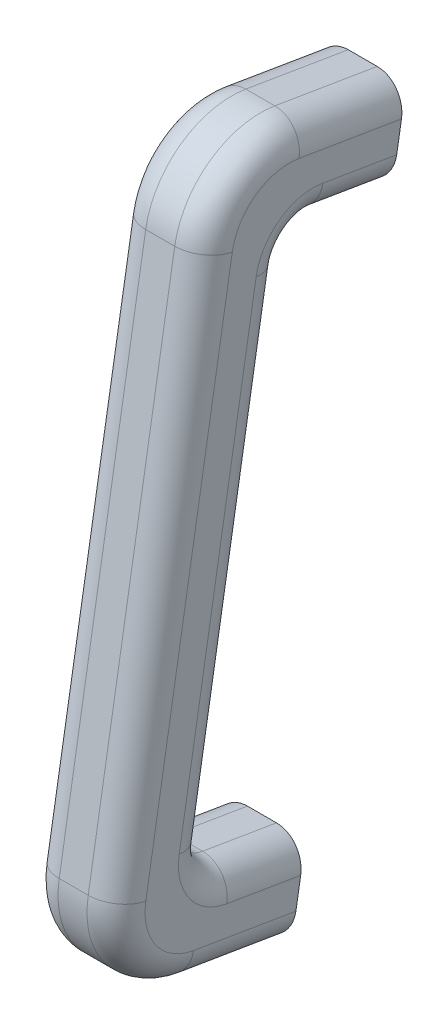
ISO-10303-21;
HEADER;
FILE_DESCRIPTION(('STEP AP214'),'2;1');
FILE_NAME('part.step','',(''),(''),'','','');
FILE_SCHEMA(('AUTOMOTIVE_DESIGN { 1 0 10303 214 1 1 1 1 }'));
ENDSEC;
DATA;
#1=APPLICATION_CONTEXT('core data for automotive mechanical design processes');
#2=APPLICATION_PROTOCOL_DEFINITION('international standard','automotive_design',2000,#1);
#3=PRODUCT_CONTEXT('',#1,'mechanical');
#4=PRODUCT('Part','Part','',(#3));
#5=PRODUCT_RELATED_PRODUCT_CATEGORY('part','',(#4));
#6=PRODUCT_DEFINITION_FORMATION('','',#4);
#7=PRODUCT_DEFINITION_CONTEXT('part definition',#1,'design');
#8=PRODUCT_DEFINITION('design','',#6,#7);
#9=PRODUCT_DEFINITION_SHAPE('','',#8);
#10=(LENGTH_UNIT() NAMED_UNIT(*) SI_UNIT(.MILLI.,.METRE.));
#11=(NAMED_UNIT(*) PLANE_ANGLE_UNIT() SI_UNIT($,.RADIAN.));
#12=(NAMED_UNIT(*) SI_UNIT($,.STERADIAN.) SOLID_ANGLE_UNIT());
#13=UNCERTAINTY_MEASURE_WITH_UNIT(LENGTH_MEASURE(1.E-05),#10,'distance_accuracy_value','');
#14=(GEOMETRIC_REPRESENTATION_CONTEXT(3) GLOBAL_UNCERTAINTY_ASSIGNED_CONTEXT((#13)) GLOBAL_UNIT_ASSIGNED_CONTEXT((#10,
#11,#12)) REPRESENTATION_CONTEXT('',''));
#15=CARTESIAN_POINT('',(0.,0.,0.));
#16=DIRECTION('',(0.,0.,1.));
#17=DIRECTION('',(1.,0.,0.));
#18=AXIS2_PLACEMENT_3D('',#15,#16,#17);
#19=CARTESIAN_POINT('',(1797.5,1188.32020540186,1266.62931115991));
#20=DIRECTION('',(0.,-0.986393923832143,0.164398987305364));
#21=DIRECTION('',(0.,-0.164398987305364,-0.986393923832143));
#22=AXIS2_PLACEMENT_3D('',#19,#20,#21);
#23=PLANE('',#22);
#24=DIRECTION('',(1.,0.,0.));
#25=VECTOR('',#24,1.);
#26=CARTESIAN_POINT('',(1797.5,1185.85422059228,1251.83340230243));
#27=LINE('',#26,#25);
#28=CARTESIAN_POINT('',(1802.5,1185.85422059228,1251.83340230243));
#29=VERTEX_POINT('',#28);
#30=CARTESIAN_POINT('',(1807.5,1185.85422059228,1251.83340230243));
#31=VERTEX_POINT('',#30);
#32=EDGE_CURVE('E220',#29,#31,#27,.T.);
#33=ORIENTED_EDGE('',*,*,#32,.T.);
#34=DIRECTION('',(0.,-0.164398987305364,-0.986393923832143));
#35=VECTOR('',#34,1.);
#36=CARTESIAN_POINT('',(1807.5,1188.32020540186,1266.62931115991));
#37=LINE('',#36,#35);
#38=CARTESIAN_POINT('',(1807.5,1182.91220344615,1234.18129942564));
#39=VERTEX_POINT('',#38);
#40=EDGE_CURVE('E309',#31,#39,#37,.T.);
#41=ORIENTED_EDGE('',*,*,#40,.T.);
#42=DIRECTION('',(1.,0.,0.));
#43=VECTOR('',#42,1.);
#44=CARTESIAN_POINT('',(1797.5,1182.91220344615,1234.18129942564));
#45=LINE('',#44,#43);
#46=CARTESIAN_POINT('',(1802.5,1182.91220344615,1234.18129942564));
#47=VERTEX_POINT('',#46);
#48=EDGE_CURVE('E482',#47,#39,#45,.T.);
#49=ORIENTED_EDGE('',*,*,#48,.F.);
#50=DIRECTION('',(0.,-0.164398987305364,-0.986393923832143));
#51=VECTOR('',#50,1.);
#52=CARTESIAN_POINT('',(1802.5,1185.85422059228,1251.83340230243));
#53=LINE('',#52,#51);
#54=EDGE_CURVE('E306',#47,#29,#53,.F.);
#55=ORIENTED_EDGE('',*,*,#54,.T.);
#56=EDGE_LOOP('',(#33,#41,#49,#55));
#57=FACE_BOUND('',#56,.T.);
#58=ADVANCED_FACE('F17',(#57),#23,.F.);
#59=CARTESIAN_POINT('',(1797.5,1182.91220344615,1234.18129942564));
#60=DIRECTION('',(0.,0.164398987305352,0.986393923832145));
#61=DIRECTION('',(0.,-0.986393923832145,0.164398987305352));
#62=AXIS2_PLACEMENT_3D('',#59,#60,#61);
#63=PLANE('',#62);
#64=ORIENTED_EDGE('',*,*,#48,.T.);
#65=CARTESIAN_POINT('',(1807.5,1177.98023382699,1235.00329436217));
#66=DIRECTION('',(0.,0.164398987305352,0.986393923832145));
#67=DIRECTION('',(0.,-0.986393923832145,0.164398987305352));
#68=AXIS2_PLACEMENT_3D('',#65,#66,#67);
#69=CIRCLE('',#68,5.);
#70=CARTESIAN_POINT('',(1812.5,1177.98023382699,1235.00329436217));
#71=VERTEX_POINT('',#70);
#72=EDGE_CURVE('E321',#39,#71,#69,.F.);
#73=ORIENTED_EDGE('',*,*,#72,.T.);
#74=DIRECTION('',(0.,-0.986393923832145,0.164398987305352));
#75=VECTOR('',#74,1.);
#76=CARTESIAN_POINT('',(1812.5,1182.91220344615,1234.18129942564));
#77=LINE('',#76,#75);
#78=CARTESIAN_POINT('',(1812.5,1173.04826420783,1235.82528929869));
#79=VERTEX_POINT('',#78);
#80=EDGE_CURVE('E391',#71,#79,#77,.T.);
#81=ORIENTED_EDGE('',*,*,#80,.T.);
#82=CARTESIAN_POINT('',(1807.5,1173.04826420783,1235.82528929869));
#83=DIRECTION('',(0.,0.164398987305352,0.986393923832145));
#84=DIRECTION('',(0.,-0.986393923832145,0.164398987305352));
#85=AXIS2_PLACEMENT_3D('',#82,#83,#84);
#86=CIRCLE('',#85,5.);
#87=CARTESIAN_POINT('',(1807.5,1168.11629458867,1236.64728423522));
#88=VERTEX_POINT('',#87);
#89=EDGE_CURVE('E318',#79,#88,#86,.F.);
#90=ORIENTED_EDGE('',*,*,#89,.T.);
#91=DIRECTION('',(1.,0.,0.));
#92=VECTOR('',#91,1.);
#93=CARTESIAN_POINT('',(1797.5,1168.11629458867,1236.64728423522));
#94=LINE('',#93,#92);
#95=CARTESIAN_POINT('',(1802.5,1168.11629458867,1236.64728423522));
#96=VERTEX_POINT('',#95);
#97=EDGE_CURVE('E478',#96,#88,#94,.T.);
#98=ORIENTED_EDGE('',*,*,#97,.F.);
#99=CARTESIAN_POINT('',(1802.5,1173.04826420783,1235.82528929869));
#100=DIRECTION('',(0.,0.164398987305352,0.986393923832145));
#101=DIRECTION('',(0.,-0.986393923832145,0.164398987305352));
#102=AXIS2_PLACEMENT_3D('',#99,#100,#101);
#103=CIRCLE('',#102,5.);
#104=CARTESIAN_POINT('',(1797.5,1173.04826420783,1235.82528929869));
#105=VERTEX_POINT('',#104);
#106=EDGE_CURVE('E312',#96,#105,#103,.F.);
#107=ORIENTED_EDGE('',*,*,#106,.T.);
#108=DIRECTION('',(0.,-0.986393923832145,0.164398987305352));
#109=VECTOR('',#108,1.);
#110=CARTESIAN_POINT('',(1797.5,1182.91220344615,1234.18129942564));
#111=LINE('',#110,#109);
#112=CARTESIAN_POINT('',(1797.5,1177.98023382699,1235.00329436217));
#113=VERTEX_POINT('',#112);
#114=EDGE_CURVE('E461',#113,#105,#111,.T.);
#115=ORIENTED_EDGE('',*,*,#114,.F.);
#116=CARTESIAN_POINT('',(1802.5,1177.98023382699,1235.00329436217));
#117=DIRECTION('',(0.,0.164398987305352,0.986393923832145));
#118=DIRECTION('',(0.,-0.986393923832145,0.164398987305352));
#119=AXIS2_PLACEMENT_3D('',#116,#117,#118);
#120=CIRCLE('',#119,5.);
#121=EDGE_CURVE('E315',#113,#47,#120,.F.);
#122=ORIENTED_EDGE('',*,*,#121,.T.);
#123=EDGE_LOOP('',(#64,#73,#81,#90,#98,#107,#115,#122));
#124=FACE_BOUND('',#123,.T.);
#125=ADVANCED_FACE('F507',(#124),#63,.F.);
#126=CARTESIAN_POINT('',(1797.5,1168.11629458867,1236.64728423522));
#127=DIRECTION('',(0.,0.986393923832145,-0.164398987305349));
#128=DIRECTION('',(0.,0.164398987305349,0.986393923832145));
#129=AXIS2_PLACEMENT_3D('',#126,#127,#128);
#130=PLANE('',#129);
#131=ORIENTED_EDGE('',*,*,#97,.T.);
#132=DIRECTION('',(0.,0.164398987305349,0.986393923832145));
#133=VECTOR('',#132,1.);
#134=CARTESIAN_POINT('',(1807.5,1168.11629458867,1236.64728423522));
#135=LINE('',#134,#133);
#136=CARTESIAN_POINT('',(1807.5,1170.23631679827,1249.36741749285));
#137=VERTEX_POINT('',#136);
#138=EDGE_CURVE('E352',#88,#137,#135,.T.);
#139=ORIENTED_EDGE('',*,*,#138,.T.);
#140=DIRECTION('',(1.,0.,0.));
#141=VECTOR('',#140,1.);
#142=CARTESIAN_POINT('',(1797.5,1170.23631679827,1249.36741749285));
#143=LINE('',#142,#141);
#144=CARTESIAN_POINT('',(1802.5,1170.23631679827,1249.36741749285));
#145=VERTEX_POINT('',#144);
#146=EDGE_CURVE('E243',#137,#145,#143,.F.);
#147=ORIENTED_EDGE('',*,*,#146,.T.);
#148=DIRECTION('',(0.,0.164398987305349,0.986393923832145));
#149=VECTOR('',#148,1.);
#150=CARTESIAN_POINT('',(1802.5,1168.11629458867,1236.64728423522));
#151=LINE('',#150,#149);
#152=EDGE_CURVE('E349',#145,#96,#151,.F.);
#153=ORIENTED_EDGE('',*,*,#152,.T.);
#154=EDGE_LOOP('',(#131,#139,#147,#153));
#155=FACE_BOUND('',#154,.T.);
#156=ADVANCED_FACE('F527',(#155),#130,.F.);
#157=CARTESIAN_POINT('',(1797.5,1171.0583117348,1254.29938711201));
#158=DIRECTION('',(0.,0.16439898730535,0.986393923832145));
#159=DIRECTION('',(0.,-0.986393923832145,0.16439898730535));
#160=AXIS2_PLACEMENT_3D('',#157,#158,#159);
#161=PLANE('',#160);
#162=DIRECTION('',(1.,0.,0.));
#163=VECTOR('',#162,1.);
#164=CARTESIAN_POINT('',(1812.5,1166.12634211564,1255.12138204854));
#165=LINE('',#164,#163);
#166=CARTESIAN_POINT('',(1802.5,1166.12634211564,1255.12138204854));
#167=VERTEX_POINT('',#166);
#168=CARTESIAN_POINT('',(1807.5,1166.12634211564,1255.12138204854));
#169=VERTEX_POINT('',#168);
#170=EDGE_CURVE('E239',#167,#169,#165,.T.);
#171=ORIENTED_EDGE('',*,*,#170,.T.);
#172=DIRECTION('',(0.,-0.986393923832145,0.16439898730535));
#173=VECTOR('',#172,1.);
#174=CARTESIAN_POINT('',(1807.5,1171.0583117348,1254.29938711201));
#175=LINE('',#174,#173);
#176=CARTESIAN_POINT('',(1807.5,1086.55049818209,1268.38402270413));
#177=VERTEX_POINT('',#176);
#178=EDGE_CURVE('E340',#169,#177,#175,.T.);
#179=ORIENTED_EDGE('',*,*,#178,.T.);
#180=DIRECTION('',(1.,0.,0.));
#181=VECTOR('',#180,1.);
#182=CARTESIAN_POINT('',(1797.5,1086.55049818209,1268.38402270413));
#183=LINE('',#182,#181);
#184=CARTESIAN_POINT('',(1802.5,1086.55049818209,1268.38402270413));
#185=VERTEX_POINT('',#184);
#186=EDGE_CURVE('E229',#177,#185,#183,.F.);
#187=ORIENTED_EDGE('',*,*,#186,.T.);
#188=DIRECTION('',(0.,-0.986393923832145,0.16439898730535));
#189=VECTOR('',#188,1.);
#190=CARTESIAN_POINT('',(1802.5,1166.12634211564,1255.12138204854));
#191=LINE('',#190,#189);
#192=EDGE_CURVE('E337',#185,#167,#191,.F.);
#193=ORIENTED_EDGE('',*,*,#192,.T.);
#194=EDGE_LOOP('',(#171,#179,#187,#193));
#195=FACE_BOUND('',#194,.T.);
#196=ADVANCED_FACE('F540',(#195),#161,.F.);
#197=CARTESIAN_POINT('',(1797.5,1081.61852856293,1269.20601764065));
#198=DIRECTION('',(0.,-0.986393923832144,0.164398987305353));
#199=DIRECTION('',(0.,-0.164398987305353,-0.986393923832145));
#200=AXIS2_PLACEMENT_3D('',#197,#198,#199);
#201=PLANE('',#200);
#202=DIRECTION('',(1.,0.,0.));
#203=VECTOR('',#202,1.);
#204=CARTESIAN_POINT('',(1812.5,1080.7965336264,1264.27404802149));
#205=LINE('',#204,#203);
#206=CARTESIAN_POINT('',(1802.5,1080.7965336264,1264.27404802149));
#207=VERTEX_POINT('',#206);
#208=CARTESIAN_POINT('',(1807.5,1080.7965336264,1264.27404802149));
#209=VERTEX_POINT('',#208);
#210=EDGE_CURVE('E247',#207,#209,#205,.T.);
#211=ORIENTED_EDGE('',*,*,#210,.T.);
#212=DIRECTION('',(0.,-0.164398987305353,-0.986393923832145));
#213=VECTOR('',#212,1.);
#214=CARTESIAN_POINT('',(1807.5,1081.61852856293,1269.20601764065));
#215=LINE('',#214,#213);
#216=CARTESIAN_POINT('',(1807.5,1078.6765114168,1251.55391476386));
#217=VERTEX_POINT('',#216);
#218=EDGE_CURVE('E327',#209,#217,#215,.T.);
#219=ORIENTED_EDGE('',*,*,#218,.T.);
#220=DIRECTION('',(1.,0.,0.));
#221=VECTOR('',#220,1.);
#222=CARTESIAN_POINT('',(1797.5,1078.6765114168,1251.55391476386));
#223=LINE('',#222,#221);
#224=CARTESIAN_POINT('',(1802.5,1078.6765114168,1251.55391476386));
#225=VERTEX_POINT('',#224);
#226=EDGE_CURVE('E465',#225,#217,#223,.T.);
#227=ORIENTED_EDGE('',*,*,#226,.F.);
#228=DIRECTION('',(0.,-0.164398987305353,-0.986393923832145));
#229=VECTOR('',#228,1.);
#230=CARTESIAN_POINT('',(1802.5,1080.7965336264,1264.27404802149));
#231=LINE('',#230,#229);
#232=EDGE_CURVE('E324',#225,#207,#231,.F.);
#233=ORIENTED_EDGE('',*,*,#232,.T.);
#234=EDGE_LOOP('',(#211,#219,#227,#233));
#235=FACE_BOUND('',#234,.T.);
#236=ADVANCED_FACE('F559',(#235),#201,.F.);
#237=CARTESIAN_POINT('',(1797.5,1078.6765114168,1251.55391476386));
#238=DIRECTION('',(0.,0.16439898730535,0.986393923832145));
#239=DIRECTION('',(0.,-0.986393923832145,0.16439898730535));
#240=AXIS2_PLACEMENT_3D('',#237,#238,#239);
#241=PLANE('',#240);
#242=DIRECTION('',(0.,-0.986393923832145,0.16439898730535));
#243=VECTOR('',#242,1.);
#244=CARTESIAN_POINT('',(1812.5,1078.6765114168,1251.55391476386));
#245=LINE('',#244,#243);
#246=CARTESIAN_POINT('',(1812.5,1073.74454179764,1252.37590970039));
#247=VERTEX_POINT('',#246);
#248=CARTESIAN_POINT('',(1812.5,1068.81257217848,1253.19790463692));
#249=VERTEX_POINT('',#248);
#250=EDGE_CURVE('E469',#247,#249,#245,.T.);
#251=ORIENTED_EDGE('',*,*,#250,.T.);
#252=CARTESIAN_POINT('',(1807.5,1068.81257217848,1253.19790463692));
#253=DIRECTION('',(0.,0.16439898730535,0.986393923832145));
#254=DIRECTION('',(0.,-0.986393923832145,0.16439898730535));
#255=AXIS2_PLACEMENT_3D('',#252,#253,#254);
#256=CIRCLE('',#255,5.);
#257=CARTESIAN_POINT('',(1807.5,1063.88060255931,1254.01989957345));
#258=VERTEX_POINT('',#257);
#259=EDGE_CURVE('E290',#249,#258,#256,.F.);
#260=ORIENTED_EDGE('',*,*,#259,.T.);
#261=DIRECTION('',(1.,0.,0.));
#262=VECTOR('',#261,1.);
#263=CARTESIAN_POINT('',(1797.5,1063.88060255931,1254.01989957345));
#264=LINE('',#263,#262);
#265=CARTESIAN_POINT('',(1802.5,1063.88060255931,1254.01989957345));
#266=VERTEX_POINT('',#265);
#267=EDGE_CURVE('E212',#266,#258,#264,.T.);
#268=ORIENTED_EDGE('',*,*,#267,.F.);
#269=CARTESIAN_POINT('',(1802.5,1068.81257217848,1253.19790463692));
#270=DIRECTION('',(0.,0.16439898730535,0.986393923832145));
#271=DIRECTION('',(0.,-0.986393923832145,0.16439898730535));
#272=AXIS2_PLACEMENT_3D('',#269,#270,#271);
#273=CIRCLE('',#272,5.);
#274=CARTESIAN_POINT('',(1797.5,1068.81257217848,1253.19790463692));
#275=VERTEX_POINT('',#274);
#276=EDGE_CURVE('E284',#266,#275,#273,.F.);
#277=ORIENTED_EDGE('',*,*,#276,.T.);
#278=DIRECTION('',(0.,-0.986393923832145,0.16439898730535));
#279=VECTOR('',#278,1.);
#280=CARTESIAN_POINT('',(1797.5,1078.6765114168,1251.55391476386));
#281=LINE('',#280,#279);
#282=CARTESIAN_POINT('',(1797.5,1073.74454179764,1252.37590970039));
#283=VERTEX_POINT('',#282);
#284=EDGE_CURVE('E452',#283,#275,#281,.T.);
#285=ORIENTED_EDGE('',*,*,#284,.F.);
#286=CARTESIAN_POINT('',(1802.5,1073.74454179764,1252.37590970039));
#287=DIRECTION('',(0.,0.16439898730535,0.986393923832145));
#288=DIRECTION('',(0.,-0.986393923832145,0.16439898730535));
#289=AXIS2_PLACEMENT_3D('',#286,#287,#288);
#290=CIRCLE('',#289,5.);
#291=EDGE_CURVE('E281',#283,#225,#290,.F.);
#292=ORIENTED_EDGE('',*,*,#291,.T.);
#293=ORIENTED_EDGE('',*,*,#226,.T.);
#294=CARTESIAN_POINT('',(1807.5,1073.74454179764,1252.37590970039));
#295=DIRECTION('',(0.,0.16439898730535,0.986393923832145));
#296=DIRECTION('',(0.,-0.986393923832145,0.16439898730535));
#297=AXIS2_PLACEMENT_3D('',#294,#295,#296);
#298=CIRCLE('',#297,5.);
#299=EDGE_CURVE('E287',#217,#247,#298,.F.);
#300=ORIENTED_EDGE('',*,*,#299,.T.);
#301=EDGE_LOOP('',(#251,#260,#268,#277,#285,#292,#293,#300));
#302=FACE_BOUND('',#301,.T.);
#303=ADVANCED_FACE('F456',(#302),#241,.F.);
#304=CARTESIAN_POINT('',(1797.5,1063.88060255931,1254.01989957345));
#305=DIRECTION('',(0.,0.986393923832144,-0.164398987305358));
#306=DIRECTION('',(0.,0.164398987305358,0.986393923832144));
#307=AXIS2_PLACEMENT_3D('',#304,#305,#306);
#308=PLANE('',#307);
#309=ORIENTED_EDGE('',*,*,#267,.T.);
#310=DIRECTION('',(0.,0.164398987305358,0.986393923832144));
#311=VECTOR('',#310,1.);
#312=CARTESIAN_POINT('',(1807.5,1063.88060255931,1254.01989957345));
#313=LINE('',#312,#311);
#314=CARTESIAN_POINT('',(1807.5,1066.82261970545,1271.67200245023));
#315=VERTEX_POINT('',#314);
#316=EDGE_CURVE('E185',#258,#315,#313,.T.);
#317=ORIENTED_EDGE('',*,*,#316,.T.);
#318=DIRECTION('',(1.,0.,0.));
#319=VECTOR('',#318,1.);
#320=CARTESIAN_POINT('',(1797.5,1066.82261970545,1271.67200245023));
#321=LINE('',#320,#319);
#322=CARTESIAN_POINT('',(1802.5,1066.82261970545,1271.67200245023));
#323=VERTEX_POINT('',#322);
#324=EDGE_CURVE('E209',#315,#323,#321,.F.);
#325=ORIENTED_EDGE('',*,*,#324,.T.);
#326=DIRECTION('',(0.,0.164398987305358,0.986393923832144));
#327=VECTOR('',#326,1.);
#328=CARTESIAN_POINT('',(1802.5,1063.88060255931,1254.01989957345));
#329=LINE('',#328,#327);
#330=EDGE_CURVE('E215',#323,#266,#329,.F.);
#331=ORIENTED_EDGE('',*,*,#330,.T.);
#332=EDGE_LOOP('',(#309,#317,#325,#331));
#333=FACE_BOUND('',#332,.T.);
#334=ADVANCED_FACE('F208',(#333),#308,.F.);
#335=CARTESIAN_POINT('',(1797.5,1069.28860451503,1286.46791130772));
#336=DIRECTION('',(0.,-0.164398987305352,-0.986393923832144));
#337=DIRECTION('',(0.,0.986393923832145,-0.164398987305352));
#338=AXIS2_PLACEMENT_3D('',#335,#336,#337);
#339=PLANE('',#338);
#340=DIRECTION('',(1.,0.,0.));
#341=VECTOR('',#340,1.);
#342=CARTESIAN_POINT('',(1797.5,1084.08451337251,1284.00192649814));
#343=LINE('',#342,#341);
#344=CARTESIAN_POINT('',(1802.5,1084.08451337251,1284.00192649814));
#345=VERTEX_POINT('',#344);
#346=CARTESIAN_POINT('',(1807.5,1084.08451337251,1284.00192649814));
#347=VERTEX_POINT('',#346);
#348=EDGE_CURVE('E221',#345,#347,#343,.T.);
#349=ORIENTED_EDGE('',*,*,#348,.T.);
#350=DIRECTION('',(0.,0.986393923832145,-0.164398987305352));
#351=VECTOR('',#350,1.);
#352=CARTESIAN_POINT('',(1807.5,1069.28860451503,1286.46791130772));
#353=LINE('',#352,#351);
#354=CARTESIAN_POINT('',(1807.5,1173.52429654438,1269.09529596949));
#355=VERTEX_POINT('',#354);
#356=EDGE_CURVE('E297',#347,#355,#353,.T.);
#357=ORIENTED_EDGE('',*,*,#356,.T.);
#358=DIRECTION('',(1.,0.,0.));
#359=VECTOR('',#358,1.);
#360=CARTESIAN_POINT('',(1797.5,1173.52429654438,1269.09529596949));
#361=LINE('',#360,#359);
#362=CARTESIAN_POINT('',(1802.5,1173.52429654438,1269.09529596949));
#363=VERTEX_POINT('',#362);
#364=EDGE_CURVE('E232',#355,#363,#361,.F.);
#365=ORIENTED_EDGE('',*,*,#364,.T.);
#366=DIRECTION('',(0.,0.986393923832145,-0.164398987305352));
#367=VECTOR('',#366,1.);
#368=CARTESIAN_POINT('',(1802.5,1084.08451337251,1284.00192649814));
#369=LINE('',#368,#367);
#370=EDGE_CURVE('E202',#363,#345,#369,.F.);
#371=ORIENTED_EDGE('',*,*,#370,.T.);
#372=EDGE_LOOP('',(#349,#357,#365,#371));
#373=FACE_BOUND('',#372,.T.);
#374=ADVANCED_FACE('F490',(#373),#339,.F.);
#375=CARTESIAN_POINT('',(1797.5,0.,0.));
#376=DIRECTION('',(-1.,0.,0.));
#377=DIRECTION('',(0.,0.,1.));
#378=AXIS2_PLACEMENT_3D('',#375,#376,#377);
#379=PLANE('',#378);
#380=CARTESIAN_POINT('',(1797.5,1171.0583117348,1254.29938711201));
#381=DIRECTION('',(-1.,0.,0.));
#382=DIRECTION('',(0.,0.,1.));
#383=AXIS2_PLACEMENT_3D('',#380,#381,#382);
#384=CIRCLE('',#383,10.);
#385=CARTESIAN_POINT('',(1797.5,1172.70230160786,1264.16332635033));
#386=VERTEX_POINT('',#385);
#387=CARTESIAN_POINT('',(1797.5,1180.92225097312,1252.65539723895));
#388=VERTEX_POINT('',#387);
#389=EDGE_CURVE('E27',#386,#388,#384,.T.);
#390=ORIENTED_EDGE('',*,*,#389,.T.);
#391=DIRECTION('',(0.,-0.164398987305364,-0.986393923832143));
#392=VECTOR('',#391,1.);
#393=CARTESIAN_POINT('',(1797.5,1177.98023382699,1235.00329436217));
#394=LINE('',#393,#392);
#395=EDGE_CURVE('E11',#388,#113,#394,.T.);
#396=ORIENTED_EDGE('',*,*,#395,.T.);
#397=ORIENTED_EDGE('',*,*,#114,.T.);
#398=DIRECTION('',(0.,0.164398987305349,0.986393923832145));
#399=VECTOR('',#398,1.);
#400=CARTESIAN_POINT('',(1797.5,1175.16828641744,1248.54542255632));
#401=LINE('',#400,#399);
#402=CARTESIAN_POINT('',(1797.5,1175.16828641744,1248.54542255632));
#403=VERTEX_POINT('',#402);
#404=EDGE_CURVE('E367',#105,#403,#401,.T.);
#405=ORIENTED_EDGE('',*,*,#404,.T.);
#406=CARTESIAN_POINT('',(1797.5,1165.30434717911,1250.18941242937));
#407=DIRECTION('',(-1.,0.,0.));
#408=DIRECTION('',(0.,0.,1.));
#409=AXIS2_PLACEMENT_3D('',#406,#407,#408);
#410=CIRCLE('',#409,10.);
#411=CARTESIAN_POINT('',(1797.5,1166.94833705217,1260.0533516677));
#412=VERTEX_POINT('',#411);
#413=EDGE_CURVE('E364',#403,#412,#410,.F.);
#414=ORIENTED_EDGE('',*,*,#413,.T.);
#415=DIRECTION('',(0.,-0.986393923832145,0.16439898730535));
#416=VECTOR('',#415,1.);
#417=CARTESIAN_POINT('',(1797.5,1087.37249311862,1273.31599232329));
#418=LINE('',#417,#416);
#419=CARTESIAN_POINT('',(1797.5,1087.37249311862,1273.31599232329));
#420=VERTEX_POINT('',#419);
#421=EDGE_CURVE('E361',#412,#420,#418,.T.);
#422=ORIENTED_EDGE('',*,*,#421,.T.);
#423=CARTESIAN_POINT('',(1797.5,1085.72850324556,1263.45205308497));
#424=DIRECTION('',(-1.,0.,0.));
#425=DIRECTION('',(0.,0.,1.));
#426=AXIS2_PLACEMENT_3D('',#423,#424,#425);
#427=CIRCLE('',#426,10.);
#428=CARTESIAN_POINT('',(1797.5,1075.86456400724,1265.09604295802));
#429=VERTEX_POINT('',#428);
#430=EDGE_CURVE('E358',#420,#429,#427,.F.);
#431=ORIENTED_EDGE('',*,*,#430,.T.);
#432=DIRECTION('',(0.,-0.164398987305353,-0.986393923832145));
#433=VECTOR('',#432,1.);
#434=CARTESIAN_POINT('',(1797.5,1073.74454179764,1252.37590970039));
#435=LINE('',#434,#433);
#436=EDGE_CURVE('E355',#429,#283,#435,.T.);
#437=ORIENTED_EDGE('',*,*,#436,.T.);
#438=ORIENTED_EDGE('',*,*,#284,.T.);
#439=DIRECTION('',(0.,0.164398987305358,0.986393923832144));
#440=VECTOR('',#439,1.);
#441=CARTESIAN_POINT('',(1797.5,1071.75458932461,1270.85000751371));
#442=LINE('',#441,#440);
#443=CARTESIAN_POINT('',(1797.5,1071.75458932461,1270.85000751371));
#444=VERTEX_POINT('',#443);
#445=EDGE_CURVE('E371',#275,#444,#442,.T.);
#446=ORIENTED_EDGE('',*,*,#445,.T.);
#447=CARTESIAN_POINT('',(1797.5,1081.61852856293,1269.20601764065));
#448=DIRECTION('',(-1.,0.,0.));
#449=DIRECTION('',(0.,0.,1.));
#450=AXIS2_PLACEMENT_3D('',#447,#448,#449);
#451=CIRCLE('',#450,10.);
#452=CARTESIAN_POINT('',(1797.5,1083.26251843598,1279.06995687898));
#453=VERTEX_POINT('',#452);
#454=EDGE_CURVE('E374',#444,#453,#451,.T.);
#455=ORIENTED_EDGE('',*,*,#454,.T.);
#456=DIRECTION('',(0.,0.986393923832145,-0.164398987305352));
#457=VECTOR('',#456,1.);
#458=CARTESIAN_POINT('',(1797.5,1172.70230160786,1264.16332635033));
#459=LINE('',#458,#457);
#460=EDGE_CURVE('E38',#453,#386,#459,.T.);
#461=ORIENTED_EDGE('',*,*,#460,.T.);
#462=EDGE_LOOP('',(#390,#396,#397,#405,#414,#422,#431,#437,#438,#446,#455,#461));
#463=FACE_BOUND('',#462,.T.);
#464=ADVANCED_FACE('F451',(#463),#379,.T.);
#465=CARTESIAN_POINT('',(1812.5,0.,0.));
#466=DIRECTION('',(-1.,0.,0.));
#467=DIRECTION('',(0.,0.,1.));
#468=AXIS2_PLACEMENT_3D('',#465,#466,#467);
#469=PLANE('',#468);
#470=CARTESIAN_POINT('',(1812.5,1081.61852856293,1269.20601764065));
#471=DIRECTION('',(-1.,0.,0.));
#472=DIRECTION('',(0.,0.,1.));
#473=AXIS2_PLACEMENT_3D('',#470,#471,#472);
#474=CIRCLE('',#473,10.);
#475=CARTESIAN_POINT('',(1812.5,1083.26251843598,1279.06995687898));
#476=VERTEX_POINT('',#475);
#477=CARTESIAN_POINT('',(1812.5,1071.75458932461,1270.85000751371));
#478=VERTEX_POINT('',#477);
#479=EDGE_CURVE('E276',#476,#478,#474,.F.);
#480=ORIENTED_EDGE('',*,*,#479,.T.);
#481=DIRECTION('',(0.,0.164398987305358,0.986393923832144));
#482=VECTOR('',#481,1.);
#483=CARTESIAN_POINT('',(1812.5,836.704464070366,-139.450744011729));
#484=LINE('',#483,#482);
#485=EDGE_CURVE('E186',#478,#249,#484,.F.);
#486=ORIENTED_EDGE('',*,*,#485,.T.);
#487=ORIENTED_EDGE('',*,*,#250,.F.);
#488=DIRECTION('',(0.,-0.164398987305353,-0.986393923832145));
#489=VECTOR('',#488,1.);
#490=CARTESIAN_POINT('',(1812.5,841.636433689535,-140.272738948252));
#491=LINE('',#490,#489);
#492=CARTESIAN_POINT('',(1812.5,1075.86456400724,1265.09604295802));
#493=VERTEX_POINT('',#492);
#494=EDGE_CURVE('E264',#247,#493,#491,.F.);
#495=ORIENTED_EDGE('',*,*,#494,.T.);
#496=CARTESIAN_POINT('',(1812.5,1085.72850324556,1263.45205308497));
#497=DIRECTION('',(-1.,0.,0.));
#498=DIRECTION('',(0.,0.,1.));
#499=AXIS2_PLACEMENT_3D('',#496,#497,#498);
#500=CIRCLE('',#499,10.);
#501=CARTESIAN_POINT('',(1812.5,1087.37249311862,1273.31599232329));
#502=VERTEX_POINT('',#501);
#503=EDGE_CURVE('E261',#493,#502,#500,.T.);
#504=ORIENTED_EDGE('',*,*,#503,.T.);
#505=DIRECTION('',(0.,-0.986393923832145,0.16439898730535));
#506=VECTOR('',#505,1.);
#507=CARTESIAN_POINT('',(1812.5,235.872120190755,1415.23272114459));
#508=LINE('',#507,#506);
#509=CARTESIAN_POINT('',(1812.5,1166.94833705217,1260.0533516677));
#510=VERTEX_POINT('',#509);
#511=EDGE_CURVE('E258',#502,#510,#508,.F.);
#512=ORIENTED_EDGE('',*,*,#511,.T.);
#513=CARTESIAN_POINT('',(1812.5,1165.30434717911,1250.18941242937));
#514=DIRECTION('',(-1.,0.,0.));
#515=DIRECTION('',(0.,0.,1.));
#516=AXIS2_PLACEMENT_3D('',#513,#514,#515);
#517=CIRCLE('',#516,10.);
#518=CARTESIAN_POINT('',(1812.5,1175.16828641744,1248.54542255632));
#519=VERTEX_POINT('',#518);
#520=EDGE_CURVE('E255',#510,#519,#517,.T.);
#521=ORIENTED_EDGE('',*,*,#520,.T.);
#522=DIRECTION('',(0.,0.164398987305349,0.986393923832145));
#523=VECTOR('',#522,1.);
#524=CARTESIAN_POINT('',(1812.5,940.940156099736,-156.823359349948));
#525=LINE('',#524,#523);
#526=EDGE_CURVE('E214',#519,#79,#525,.F.);
#527=ORIENTED_EDGE('',*,*,#526,.T.);
#528=ORIENTED_EDGE('',*,*,#80,.F.);
#529=DIRECTION('',(0.,-0.164398987305364,-0.986393923832143));
#530=VECTOR('',#529,1.);
#531=CARTESIAN_POINT('',(1812.5,945.872125718873,-157.645354286486));
#532=LINE('',#531,#530);
#533=CARTESIAN_POINT('',(1812.5,1180.92225097312,1252.65539723895));
#534=VERTEX_POINT('',#533);
#535=EDGE_CURVE('E267',#71,#534,#532,.F.);
#536=ORIENTED_EDGE('',*,*,#535,.T.);
#537=CARTESIAN_POINT('',(1812.5,1171.0583117348,1254.29938711201));
#538=DIRECTION('',(-1.,0.,0.));
#539=DIRECTION('',(0.,0.,1.));
#540=AXIS2_PLACEMENT_3D('',#537,#538,#539);
#541=CIRCLE('',#540,10.);
#542=CARTESIAN_POINT('',(1812.5,1172.70230160786,1264.16332635033));
#543=VERTEX_POINT('',#542);
#544=EDGE_CURVE('E270',#534,#543,#541,.F.);
#545=ORIENTED_EDGE('',*,*,#544,.T.);
#546=DIRECTION('',(0.,0.986393923832145,-0.164398987305352));
#547=VECTOR('',#546,1.);
#548=CARTESIAN_POINT('',(1812.5,236.694115127285,1420.16469076375));
#549=LINE('',#548,#547);
#550=EDGE_CURVE('E273',#543,#476,#549,.F.);
#551=ORIENTED_EDGE('',*,*,#550,.T.);
#552=EDGE_LOOP('',(#480,#486,#487,#495,#504,#512,#521,#527,#528,#536,#545,#551));
#553=FACE_BOUND('',#552,.T.);
#554=ADVANCED_FACE('F562',(#553),#469,.F.);
#555=CARTESIAN_POINT('',(1797.5,1081.61852856293,1269.20601764065));
#556=DIRECTION('',(1.,0.,0.));
#557=DIRECTION('',(0.,0.,-1.));
#558=AXIS2_PLACEMENT_3D('',#555,#556,#557);
#559=CYLINDRICAL_SURFACE('',#558,15.);
#560=ORIENTED_EDGE('',*,*,#324,.F.);
#561=CARTESIAN_POINT('',(1807.5,1081.61852856293,1269.20601764065));
#562=DIRECTION('',(-1.,0.,0.));
#563=DIRECTION('',(0.,0.,1.));
#564=AXIS2_PLACEMENT_3D('',#561,#562,#563);
#565=CIRCLE('',#564,15.);
#566=EDGE_CURVE('E194',#315,#347,#565,.T.);
#567=ORIENTED_EDGE('',*,*,#566,.T.);
#568=ORIENTED_EDGE('',*,*,#348,.F.);
#569=CARTESIAN_POINT('',(1802.5,1081.61852856293,1269.20601764065));
#570=DIRECTION('',(-1.,0.,0.));
#571=DIRECTION('',(0.,0.,1.));
#572=AXIS2_PLACEMENT_3D('',#569,#570,#571);
#573=CIRCLE('',#572,15.);
#574=EDGE_CURVE('E203',#345,#323,#573,.F.);
#575=ORIENTED_EDGE('',*,*,#574,.T.);
#576=EDGE_LOOP('',(#560,#567,#568,#575));
#577=FACE_BOUND('',#576,.T.);
#578=ADVANCED_FACE('F217',(#577),#559,.T.);
#579=CARTESIAN_POINT('',(1797.5,1171.0583117348,1254.29938711201));
#580=DIRECTION('',(1.,0.,0.));
#581=DIRECTION('',(0.,0.,-1.));
#582=AXIS2_PLACEMENT_3D('',#579,#580,#581);
#583=CYLINDRICAL_SURFACE('',#582,15.);
#584=ORIENTED_EDGE('',*,*,#364,.F.);
#585=CARTESIAN_POINT('',(1807.5,1171.0583117348,1254.29938711201));
#586=DIRECTION('',(-1.,0.,0.));
#587=DIRECTION('',(0.,0.,1.));
#588=AXIS2_PLACEMENT_3D('',#585,#586,#587);
#589=CIRCLE('',#588,15.);
#590=EDGE_CURVE('E303',#355,#31,#589,.T.);
#591=ORIENTED_EDGE('',*,*,#590,.T.);
#592=ORIENTED_EDGE('',*,*,#32,.F.);
#593=CARTESIAN_POINT('',(1802.5,1171.0583117348,1254.29938711201));
#594=DIRECTION('',(-1.,0.,0.));
#595=DIRECTION('',(0.,0.,1.));
#596=AXIS2_PLACEMENT_3D('',#593,#594,#595);
#597=CIRCLE('',#596,15.);
#598=EDGE_CURVE('E300',#29,#363,#597,.F.);
#599=ORIENTED_EDGE('',*,*,#598,.T.);
#600=EDGE_LOOP('',(#584,#591,#592,#599));
#601=FACE_BOUND('',#600,.T.);
#602=ADVANCED_FACE('F572',(#601),#583,.T.);
#603=CARTESIAN_POINT('',(1797.5,1165.30434717911,1250.18941242937));
#604=DIRECTION('',(-1.,0.,0.));
#605=DIRECTION('',(0.,0.,1.));
#606=AXIS2_PLACEMENT_3D('',#603,#604,#605);
#607=CYLINDRICAL_SURFACE('',#606,5.);
#608=ORIENTED_EDGE('',*,*,#146,.F.);
#609=CARTESIAN_POINT('',(1807.5,1165.30434717911,1250.18941242937));
#610=DIRECTION('',(-1.,0.,0.));
#611=DIRECTION('',(0.,0.,1.));
#612=AXIS2_PLACEMENT_3D('',#609,#610,#611);
#613=CIRCLE('',#612,5.);
#614=EDGE_CURVE('E346',#137,#169,#613,.F.);
#615=ORIENTED_EDGE('',*,*,#614,.T.);
#616=ORIENTED_EDGE('',*,*,#170,.F.);
#617=CARTESIAN_POINT('',(1802.5,1165.30434717911,1250.18941242937));
#618=DIRECTION('',(-1.,0.,0.));
#619=DIRECTION('',(0.,0.,1.));
#620=AXIS2_PLACEMENT_3D('',#617,#618,#619);
#621=CIRCLE('',#620,5.);
#622=EDGE_CURVE('E343',#167,#145,#621,.T.);
#623=ORIENTED_EDGE('',*,*,#622,.T.);
#624=EDGE_LOOP('',(#608,#615,#616,#623));
#625=FACE_BOUND('',#624,.T.);
#626=ADVANCED_FACE('F524',(#625),#607,.F.);
#627=CARTESIAN_POINT('',(1797.5,1085.72850324556,1263.45205308497));
#628=DIRECTION('',(-1.,0.,0.));
#629=DIRECTION('',(0.,0.,1.));
#630=AXIS2_PLACEMENT_3D('',#627,#628,#629);
#631=CYLINDRICAL_SURFACE('',#630,5.);
#632=ORIENTED_EDGE('',*,*,#186,.F.);
#633=CARTESIAN_POINT('',(1807.5,1085.72850324556,1263.45205308497));
#634=DIRECTION('',(-1.,0.,0.));
#635=DIRECTION('',(0.,0.,1.));
#636=AXIS2_PLACEMENT_3D('',#633,#634,#635);
#637=CIRCLE('',#636,5.);
#638=EDGE_CURVE('E334',#177,#209,#637,.F.);
#639=ORIENTED_EDGE('',*,*,#638,.T.);
#640=ORIENTED_EDGE('',*,*,#210,.F.);
#641=CARTESIAN_POINT('',(1802.5,1085.72850324556,1263.45205308497));
#642=DIRECTION('',(-1.,0.,0.));
#643=DIRECTION('',(0.,0.,1.));
#644=AXIS2_PLACEMENT_3D('',#641,#642,#643);
#645=CIRCLE('',#644,5.);
#646=EDGE_CURVE('E331',#207,#185,#645,.T.);
#647=ORIENTED_EDGE('',*,*,#646,.T.);
#648=EDGE_LOOP('',(#632,#639,#640,#647));
#649=FACE_BOUND('',#648,.T.);
#650=ADVANCED_FACE('F544',(#649),#631,.F.);
#651=CARTESIAN_POINT('',(1807.5,1183.3882357827,1267.45130609644));
#652=DIRECTION('',(0.,-0.164398987305364,-0.986393923832143));
#653=DIRECTION('',(0.,0.986393923832143,-0.164398987305364));
#654=AXIS2_PLACEMENT_3D('',#651,#652,#653);
#655=CYLINDRICAL_SURFACE('',#654,5.);
#656=ORIENTED_EDGE('',*,*,#72,.F.);
#657=ORIENTED_EDGE('',*,*,#40,.F.);
#658=CARTESIAN_POINT('',(1807.5,1180.92225097312,1252.65539723895));
#659=DIRECTION('',(0.,0.164398987305379,0.98639392383214));
#660=DIRECTION('',(0.,-0.98639392383214,0.164398987305379));
#661=AXIS2_PLACEMENT_3D('',#658,#659,#660);
#662=CIRCLE('',#661,5.);
#663=EDGE_CURVE('E387',#534,#31,#662,.T.);
#664=ORIENTED_EDGE('',*,*,#663,.F.);
#665=ORIENTED_EDGE('',*,*,#535,.F.);
#666=EDGE_LOOP('',(#656,#657,#664,#665));
#667=FACE_BOUND('',#666,.T.);
#668=ADVANCED_FACE('F577',(#667),#655,.T.);
#669=CARTESIAN_POINT('',(1807.5,1171.0583117348,1254.29938711201));
#670=DIRECTION('',(-1.,0.,0.));
#671=DIRECTION('',(0.,0.,1.));
#672=AXIS2_PLACEMENT_3D('',#669,#670,#671);
#673=TOROIDAL_SURFACE('',#672,10.,5.);
#674=ORIENTED_EDGE('',*,*,#663,.T.);
#675=ORIENTED_EDGE('',*,*,#590,.F.);
#676=CARTESIAN_POINT('',(1807.5,1172.70230160786,1264.16332635033));
#677=DIRECTION('',(0.,-0.986393923832147,0.164398987305336));
#678=DIRECTION('',(0.,-0.164398987305336,-0.986393923832147));
#679=AXIS2_PLACEMENT_3D('',#676,#677,#678);
#680=CIRCLE('',#679,5.);
#681=EDGE_CURVE('E383',#543,#355,#680,.T.);
#682=ORIENTED_EDGE('',*,*,#681,.F.);
#683=ORIENTED_EDGE('',*,*,#544,.F.);
#684=EDGE_LOOP('',(#674,#675,#682,#683));
#685=FACE_BOUND('',#684,.T.);
#686=ADVANCED_FACE('F569',(#685),#673,.T.);
#687=CARTESIAN_POINT('',(1807.5,1068.4666095785,1281.53594168856));
#688=DIRECTION('',(0.,0.986393923832145,-0.164398987305352));
#689=DIRECTION('',(0.,0.164398987305352,0.986393923832145));
#690=AXIS2_PLACEMENT_3D('',#687,#688,#689);
#691=CYLINDRICAL_SURFACE('',#690,5.);
#692=ORIENTED_EDGE('',*,*,#681,.T.);
#693=ORIENTED_EDGE('',*,*,#356,.F.);
#694=CARTESIAN_POINT('',(1807.5,1083.26251843598,1279.06995687898));
#695=DIRECTION('',(0.,-0.986393923832147,0.164398987305336));
#696=DIRECTION('',(0.,-0.164398987305336,-0.986393923832147));
#697=AXIS2_PLACEMENT_3D('',#694,#695,#696);
#698=CIRCLE('',#697,5.);
#699=EDGE_CURVE('E190',#476,#347,#698,.T.);
#700=ORIENTED_EDGE('',*,*,#699,.F.);
#701=ORIENTED_EDGE('',*,*,#550,.F.);
#702=EDGE_LOOP('',(#692,#693,#700,#701));
#703=FACE_BOUND('',#702,.T.);
#704=ADVANCED_FACE('F567',(#703),#691,.T.);
#705=CARTESIAN_POINT('',(1807.5,1081.61852856293,1269.20601764065));
#706=DIRECTION('',(-1.,0.,0.));
#707=DIRECTION('',(0.,0.,1.));
#708=AXIS2_PLACEMENT_3D('',#705,#706,#707);
#709=TOROIDAL_SURFACE('',#708,10.,5.);
#710=ORIENTED_EDGE('',*,*,#699,.T.);
#711=ORIENTED_EDGE('',*,*,#566,.F.);
#712=CARTESIAN_POINT('',(1807.5,1071.75458932461,1270.85000751371));
#713=DIRECTION('',(0.,-0.164398987305336,-0.986393923832147));
#714=DIRECTION('',(0.,0.986393923832147,-0.164398987305336));
#715=AXIS2_PLACEMENT_3D('',#712,#713,#714);
#716=CIRCLE('',#715,5.);
#717=EDGE_CURVE('E180',#478,#315,#716,.T.);
#718=ORIENTED_EDGE('',*,*,#717,.F.);
#719=ORIENTED_EDGE('',*,*,#479,.F.);
#720=EDGE_LOOP('',(#710,#711,#718,#719));
#721=FACE_BOUND('',#720,.T.);
#722=ADVANCED_FACE('F195',(#721),#709,.T.);
#723=CARTESIAN_POINT('',(1807.5,1068.81257217848,1253.19790463692));
#724=DIRECTION('',(0.,0.164398987305358,0.986393923832144));
#725=DIRECTION('',(0.,-0.986393923832144,0.164398987305358));
#726=AXIS2_PLACEMENT_3D('',#723,#724,#725);
#727=CYLINDRICAL_SURFACE('',#726,5.);
#728=ORIENTED_EDGE('',*,*,#259,.F.);
#729=ORIENTED_EDGE('',*,*,#485,.F.);
#730=ORIENTED_EDGE('',*,*,#717,.T.);
#731=ORIENTED_EDGE('',*,*,#316,.F.);
#732=EDGE_LOOP('',(#728,#729,#730,#731));
#733=FACE_BOUND('',#732,.T.);
#734=ADVANCED_FACE('F183',(#733),#727,.T.);
#735=CARTESIAN_POINT('',(1807.5,1173.04826420783,1235.82528929869));
#736=DIRECTION('',(0.,0.164398987305349,0.986393923832145));
#737=DIRECTION('',(0.,-0.986393923832145,0.164398987305349));
#738=AXIS2_PLACEMENT_3D('',#735,#736,#737);
#739=CYLINDRICAL_SURFACE('',#738,5.);
#740=ORIENTED_EDGE('',*,*,#89,.F.);
#741=ORIENTED_EDGE('',*,*,#526,.F.);
#742=CARTESIAN_POINT('',(1807.5,1175.16828641744,1248.54542255632));
#743=DIRECTION('',(0.,0.164398987305336,0.986393923832147));
#744=DIRECTION('',(0.,-0.986393923832147,0.164398987305336));
#745=AXIS2_PLACEMENT_3D('',#742,#743,#744);
#746=CIRCLE('',#745,5.);
#747=EDGE_CURVE('E191',#137,#519,#746,.T.);
#748=ORIENTED_EDGE('',*,*,#747,.F.);
#749=ORIENTED_EDGE('',*,*,#138,.F.);
#750=EDGE_LOOP('',(#740,#741,#748,#749));
#751=FACE_BOUND('',#750,.T.);
#752=ADVANCED_FACE('F531',(#751),#739,.T.);
#753=CARTESIAN_POINT('',(1807.5,1165.30434717911,1250.18941242937));
#754=DIRECTION('',(-1.,0.,0.));
#755=DIRECTION('',(0.,0.,1.));
#756=AXIS2_PLACEMENT_3D('',#753,#754,#755);
#757=TOROIDAL_SURFACE('',#756,10.,5.);
#758=ORIENTED_EDGE('',*,*,#747,.T.);
#759=ORIENTED_EDGE('',*,*,#520,.F.);
#760=CARTESIAN_POINT('',(1807.5,1166.94833705217,1260.0533516677));
#761=DIRECTION('',(0.,-0.986393923832147,0.164398987305336));
#762=DIRECTION('',(0.,-0.164398987305336,-0.986393923832147));
#763=AXIS2_PLACEMENT_3D('',#760,#761,#762);
#764=CIRCLE('',#763,5.);
#765=EDGE_CURVE('E401',#169,#510,#764,.T.);
#766=ORIENTED_EDGE('',*,*,#765,.F.);
#767=ORIENTED_EDGE('',*,*,#614,.F.);
#768=EDGE_LOOP('',(#758,#759,#766,#767));
#769=FACE_BOUND('',#768,.T.);
#770=ADVANCED_FACE('F537',(#769),#757,.T.);
#771=CARTESIAN_POINT('',(1807.5,1171.88030667133,1259.23135673117));
#772=DIRECTION('',(0.,-0.986393923832145,0.16439898730535));
#773=DIRECTION('',(0.,-0.16439898730535,-0.986393923832145));
#774=AXIS2_PLACEMENT_3D('',#771,#772,#773);
#775=CYLINDRICAL_SURFACE('',#774,5.);
#776=ORIENTED_EDGE('',*,*,#765,.T.);
#777=ORIENTED_EDGE('',*,*,#511,.F.);
#778=CARTESIAN_POINT('',(1807.5,1087.37249311862,1273.31599232329));
#779=DIRECTION('',(0.,-0.986393923832147,0.164398987305336));
#780=DIRECTION('',(0.,-0.164398987305336,-0.986393923832147));
#781=AXIS2_PLACEMENT_3D('',#778,#779,#780);
#782=CIRCLE('',#781,5.);
#783=EDGE_CURVE('E396',#177,#502,#782,.T.);
#784=ORIENTED_EDGE('',*,*,#783,.F.);
#785=ORIENTED_EDGE('',*,*,#178,.F.);
#786=EDGE_LOOP('',(#776,#777,#784,#785));
#787=FACE_BOUND('',#786,.T.);
#788=ADVANCED_FACE('F549',(#787),#775,.T.);
#789=CARTESIAN_POINT('',(1807.5,1085.72850324556,1263.45205308497));
#790=DIRECTION('',(-1.,0.,0.));
#791=DIRECTION('',(0.,0.,1.));
#792=AXIS2_PLACEMENT_3D('',#789,#790,#791);
#793=TOROIDAL_SURFACE('',#792,10.,5.);
#794=ORIENTED_EDGE('',*,*,#783,.T.);
#795=ORIENTED_EDGE('',*,*,#503,.F.);
#796=CARTESIAN_POINT('',(1807.5,1075.86456400724,1265.09604295802));
#797=DIRECTION('',(0.,-0.164398987305336,-0.986393923832147));
#798=DIRECTION('',(0.,0.986393923832147,-0.164398987305336));
#799=AXIS2_PLACEMENT_3D('',#796,#797,#798);
#800=CIRCLE('',#799,5.);
#801=EDGE_CURVE('E392',#209,#493,#800,.T.);
#802=ORIENTED_EDGE('',*,*,#801,.F.);
#803=ORIENTED_EDGE('',*,*,#638,.F.);
#804=EDGE_LOOP('',(#794,#795,#802,#803));
#805=FACE_BOUND('',#804,.T.);
#806=ADVANCED_FACE('F553',(#805),#793,.T.);
#807=CARTESIAN_POINT('',(1807.5,1076.68655894377,1270.02801257718));
#808=DIRECTION('',(0.,-0.164398987305353,-0.986393923832145));
#809=DIRECTION('',(0.,0.986393923832145,-0.164398987305353));
#810=AXIS2_PLACEMENT_3D('',#807,#808,#809);
#811=CYLINDRICAL_SURFACE('',#810,5.);
#812=ORIENTED_EDGE('',*,*,#801,.T.);
#813=ORIENTED_EDGE('',*,*,#494,.F.);
#814=ORIENTED_EDGE('',*,*,#299,.F.);
#815=ORIENTED_EDGE('',*,*,#218,.F.);
#816=EDGE_LOOP('',(#812,#813,#814,#815));
#817=FACE_BOUND('',#816,.T.);
#818=ADVANCED_FACE('F557',(#817),#811,.T.);
#819=CARTESIAN_POINT('',(1802.5,836.704464070366,-139.450744011729));
#820=DIRECTION('',(0.,-0.164398987305358,-0.986393923832144));
#821=DIRECTION('',(0.,0.986393923832144,-0.164398987305358));
#822=AXIS2_PLACEMENT_3D('',#819,#820,#821);
#823=CYLINDRICAL_SURFACE('',#822,5.);
#824=ORIENTED_EDGE('',*,*,#276,.F.);
#825=ORIENTED_EDGE('',*,*,#330,.F.);
#826=CARTESIAN_POINT('',(1802.5,1071.75458932461,1270.85000751371));
#827=DIRECTION('',(0.,0.164398987305336,0.986393923832147));
#828=DIRECTION('',(0.,-0.986393923832147,0.164398987305336));
#829=AXIS2_PLACEMENT_3D('',#826,#827,#828);
#830=CIRCLE('',#829,5.);
#831=EDGE_CURVE('E397',#444,#323,#830,.T.);
#832=ORIENTED_EDGE('',*,*,#831,.F.);
#833=ORIENTED_EDGE('',*,*,#445,.F.);
#834=EDGE_LOOP('',(#824,#825,#832,#833));
#835=FACE_BOUND('',#834,.T.);
#836=ADVANCED_FACE('F666',(#835),#823,.T.);
#837=CARTESIAN_POINT('',(1802.5,1081.61852856293,1269.20601764065));
#838=DIRECTION('',(-1.,0.,0.));
#839=DIRECTION('',(0.,0.,1.));
#840=AXIS2_PLACEMENT_3D('',#837,#838,#839);
#841=TOROIDAL_SURFACE('',#840,10.,5.);
#842=ORIENTED_EDGE('',*,*,#831,.T.);
#843=ORIENTED_EDGE('',*,*,#574,.F.);
#844=CARTESIAN_POINT('',(1802.5,1083.26251843598,1279.06995687898));
#845=DIRECTION('',(0.,0.986393923832147,-0.164398987305336));
#846=DIRECTION('',(0.,0.164398987305336,0.986393923832147));
#847=AXIS2_PLACEMENT_3D('',#844,#845,#846);
#848=CIRCLE('',#847,5.);
#849=EDGE_CURVE('E416',#453,#345,#848,.T.);
#850=ORIENTED_EDGE('',*,*,#849,.F.);
#851=ORIENTED_EDGE('',*,*,#454,.F.);
#852=EDGE_LOOP('',(#842,#843,#850,#851));
#853=FACE_BOUND('',#852,.T.);
#854=ADVANCED_FACE('F673',(#853),#841,.T.);
#855=CARTESIAN_POINT('',(1802.5,236.694115127285,1420.16469076375));
#856=DIRECTION('',(0.,-0.986393923832145,0.164398987305352));
#857=DIRECTION('',(0.,-0.164398987305352,-0.986393923832145));
#858=AXIS2_PLACEMENT_3D('',#855,#856,#857);
#859=CYLINDRICAL_SURFACE('',#858,5.);
#860=ORIENTED_EDGE('',*,*,#849,.T.);
#861=ORIENTED_EDGE('',*,*,#370,.F.);
#862=CARTESIAN_POINT('',(1802.5,1172.70230160786,1264.16332635033));
#863=DIRECTION('',(0.,0.986393923832147,-0.164398987305336));
#864=DIRECTION('',(0.,0.164398987305336,0.986393923832147));
#865=AXIS2_PLACEMENT_3D('',#862,#863,#864);
#866=CIRCLE('',#865,5.);
#867=EDGE_CURVE('E412',#386,#363,#866,.T.);
#868=ORIENTED_EDGE('',*,*,#867,.F.);
#869=ORIENTED_EDGE('',*,*,#460,.F.);
#870=EDGE_LOOP('',(#860,#861,#868,#869));
#871=FACE_BOUND('',#870,.T.);
#872=ADVANCED_FACE('F495',(#871),#859,.T.);
#873=CARTESIAN_POINT('',(1802.5,1171.0583117348,1254.29938711201));
#874=DIRECTION('',(-1.,0.,0.));
#875=DIRECTION('',(0.,0.,1.));
#876=AXIS2_PLACEMENT_3D('',#873,#874,#875);
#877=TOROIDAL_SURFACE('',#876,10.,5.);
#878=ORIENTED_EDGE('',*,*,#867,.T.);
#879=ORIENTED_EDGE('',*,*,#598,.F.);
#880=CARTESIAN_POINT('',(1802.5,1180.92225097312,1252.65539723895));
#881=DIRECTION('',(0.,-0.164398987305386,-0.986393923832139));
#882=DIRECTION('',(0.,0.986393923832139,-0.164398987305386));
#883=AXIS2_PLACEMENT_3D('',#880,#881,#882);
#884=CIRCLE('',#883,5.);
#885=EDGE_CURVE('E408',#388,#29,#884,.T.);
#886=ORIENTED_EDGE('',*,*,#885,.F.);
#887=ORIENTED_EDGE('',*,*,#389,.F.);
#888=EDGE_LOOP('',(#878,#879,#886,#887));
#889=FACE_BOUND('',#888,.T.);
#890=ADVANCED_FACE('F499',(#889),#877,.T.);
#891=CARTESIAN_POINT('',(1802.5,945.872125718873,-157.645354286486));
#892=DIRECTION('',(0.,0.164398987305364,0.986393923832143));
#893=DIRECTION('',(0.,-0.986393923832143,0.164398987305364));
#894=AXIS2_PLACEMENT_3D('',#891,#892,#893);
#895=CYLINDRICAL_SURFACE('',#894,5.);
#896=ORIENTED_EDGE('',*,*,#885,.T.);
#897=ORIENTED_EDGE('',*,*,#54,.F.);
#898=ORIENTED_EDGE('',*,*,#121,.F.);
#899=ORIENTED_EDGE('',*,*,#395,.F.);
#900=EDGE_LOOP('',(#896,#897,#898,#899));
#901=FACE_BOUND('',#900,.T.);
#902=ADVANCED_FACE('F503',(#901),#895,.T.);
#903=CARTESIAN_POINT('',(1802.5,841.636433689535,-140.272738948252));
#904=DIRECTION('',(0.,0.164398987305353,0.986393923832145));
#905=DIRECTION('',(0.,-0.986393923832145,0.164398987305353));
#906=AXIS2_PLACEMENT_3D('',#903,#904,#905);
#907=CYLINDRICAL_SURFACE('',#906,5.);
#908=ORIENTED_EDGE('',*,*,#291,.F.);
#909=ORIENTED_EDGE('',*,*,#436,.F.);
#910=CARTESIAN_POINT('',(1802.5,1075.86456400724,1265.09604295802));
#911=DIRECTION('',(0.,0.164398987305336,0.986393923832147));
#912=DIRECTION('',(0.,-0.986393923832147,0.164398987305336));
#913=AXIS2_PLACEMENT_3D('',#910,#911,#912);
#914=CIRCLE('',#913,5.);
#915=EDGE_CURVE('E21',#207,#429,#914,.T.);
#916=ORIENTED_EDGE('',*,*,#915,.F.);
#917=ORIENTED_EDGE('',*,*,#232,.F.);
#918=EDGE_LOOP('',(#908,#909,#916,#917));
#919=FACE_BOUND('',#918,.T.);
#920=ADVANCED_FACE('F19',(#919),#907,.T.);
#921=CARTESIAN_POINT('',(1802.5,1085.72850324556,1263.45205308497));
#922=DIRECTION('',(-1.,0.,0.));
#923=DIRECTION('',(0.,0.,1.));
#924=AXIS2_PLACEMENT_3D('',#921,#922,#923);
#925=TOROIDAL_SURFACE('',#924,10.,5.);
#926=ORIENTED_EDGE('',*,*,#915,.T.);
#927=ORIENTED_EDGE('',*,*,#430,.F.);
#928=CARTESIAN_POINT('',(1802.5,1087.37249311862,1273.31599232329));
#929=DIRECTION('',(0.,0.986393923832147,-0.164398987305336));
#930=DIRECTION('',(0.,0.164398987305336,0.986393923832147));
#931=AXIS2_PLACEMENT_3D('',#928,#929,#930);
#932=CIRCLE('',#931,5.);
#933=EDGE_CURVE('E429',#185,#420,#932,.T.);
#934=ORIENTED_EDGE('',*,*,#933,.F.);
#935=ORIENTED_EDGE('',*,*,#646,.F.);
#936=EDGE_LOOP('',(#926,#927,#934,#935));
#937=FACE_BOUND('',#936,.T.);
#938=ADVANCED_FACE('F444',(#937),#925,.T.);
#939=CARTESIAN_POINT('',(1802.5,235.872120190755,1415.23272114459));
#940=DIRECTION('',(0.,0.986393923832145,-0.16439898730535));
#941=DIRECTION('',(0.,0.16439898730535,0.986393923832145));
#942=AXIS2_PLACEMENT_3D('',#939,#940,#941);
#943=CYLINDRICAL_SURFACE('',#942,5.);
#944=ORIENTED_EDGE('',*,*,#933,.T.);
#945=ORIENTED_EDGE('',*,*,#421,.F.);
#946=CARTESIAN_POINT('',(1802.5,1166.94833705217,1260.0533516677));
#947=DIRECTION('',(0.,0.986393923832147,-0.164398987305336));
#948=DIRECTION('',(0.,0.164398987305336,0.986393923832147));
#949=AXIS2_PLACEMENT_3D('',#946,#947,#948);
#950=CIRCLE('',#949,5.);
#951=EDGE_CURVE('E426',#167,#412,#950,.T.);
#952=ORIENTED_EDGE('',*,*,#951,.F.);
#953=ORIENTED_EDGE('',*,*,#192,.F.);
#954=EDGE_LOOP('',(#944,#945,#952,#953));
#955=FACE_BOUND('',#954,.T.);
#956=ADVANCED_FACE('F518',(#955),#943,.T.);
#957=CARTESIAN_POINT('',(1802.5,1165.30434717911,1250.18941242937));
#958=DIRECTION('',(-1.,0.,0.));
#959=DIRECTION('',(0.,0.,1.));
#960=AXIS2_PLACEMENT_3D('',#957,#958,#959);
#961=TOROIDAL_SURFACE('',#960,10.,5.);
#962=ORIENTED_EDGE('',*,*,#951,.T.);
#963=ORIENTED_EDGE('',*,*,#413,.F.);
#964=CARTESIAN_POINT('',(1802.5,1175.16828641744,1248.54542255632));
#965=DIRECTION('',(0.,-0.164398987305336,-0.986393923832147));
#966=DIRECTION('',(0.,0.986393923832147,-0.164398987305336));
#967=AXIS2_PLACEMENT_3D('',#964,#965,#966);
#968=CIRCLE('',#967,5.);
#969=EDGE_CURVE('E423',#145,#403,#968,.T.);
#970=ORIENTED_EDGE('',*,*,#969,.F.);
#971=ORIENTED_EDGE('',*,*,#622,.F.);
#972=EDGE_LOOP('',(#962,#963,#970,#971));
#973=FACE_BOUND('',#972,.T.);
#974=ADVANCED_FACE('F520',(#973),#961,.T.);
#975=CARTESIAN_POINT('',(1802.5,940.940156099736,-156.823359349948));
#976=DIRECTION('',(0.,-0.164398987305349,-0.986393923832145));
#977=DIRECTION('',(0.,0.986393923832145,-0.164398987305349));
#978=AXIS2_PLACEMENT_3D('',#975,#976,#977);
#979=CYLINDRICAL_SURFACE('',#978,5.);
#980=ORIENTED_EDGE('',*,*,#106,.F.);
#981=ORIENTED_EDGE('',*,*,#152,.F.);
#982=ORIENTED_EDGE('',*,*,#969,.T.);
#983=ORIENTED_EDGE('',*,*,#404,.F.);
#984=EDGE_LOOP('',(#980,#981,#982,#983));
#985=FACE_BOUND('',#984,.T.);
#986=ADVANCED_FACE('F513',(#985),#979,.T.);
#987=CLOSED_SHELL('',(#58,#125,#156,#196,#236,#303,#334,#374,#464,#554,#578,#602,#626,#650,#668,
#686,#704,#722,#734,#752,#770,#788,#806,#818,#836,#854,#872,#890,#902,#920,#938,#956,#974,#986));
#988=MANIFOLD_SOLID_BREP('B1',#987);
#989=ADVANCED_BREP_SHAPE_REPRESENTATION('',(#18,#988),#14);
#990=SHAPE_DEFINITION_REPRESENTATION(#9,#989);
ENDSEC;
END-ISO-10303-21;
